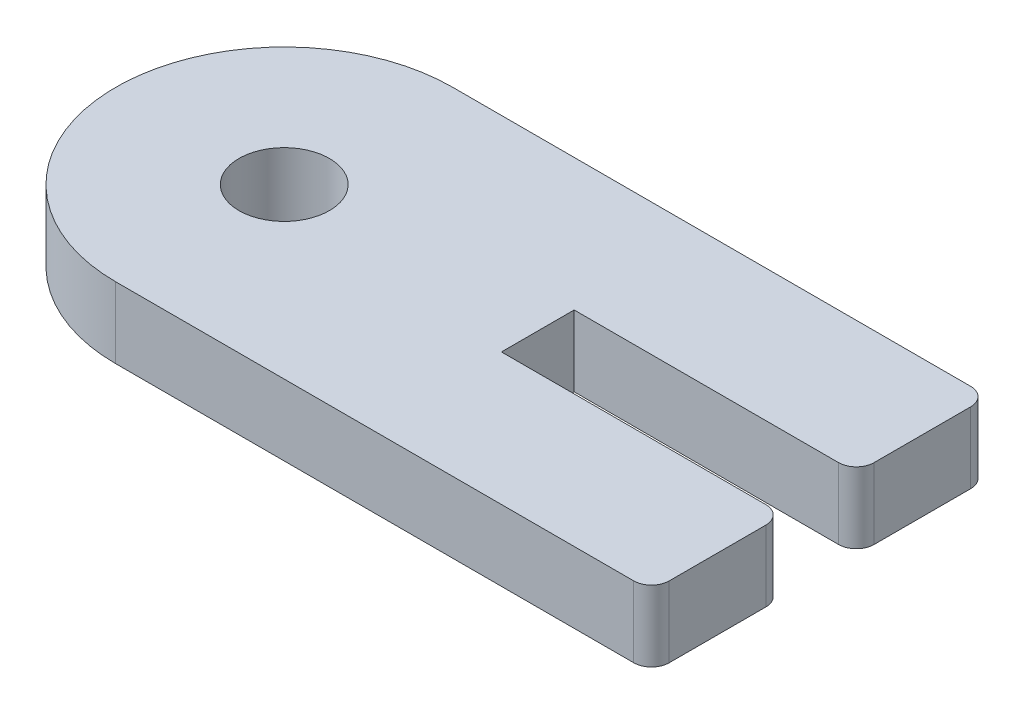
ISO-10303-21;
HEADER;
FILE_DESCRIPTION(('STEP AP214'),'2;1');
FILE_NAME('part.step','',(''),(''),'','','');
FILE_SCHEMA(('AUTOMOTIVE_DESIGN { 1 0 10303 214 1 1 1 1 }'));
ENDSEC;
DATA;
#1=APPLICATION_CONTEXT('core data for automotive mechanical design processes');
#2=APPLICATION_PROTOCOL_DEFINITION('international standard','automotive_design',2000,#1);
#3=PRODUCT_CONTEXT('',#1,'mechanical');
#4=PRODUCT('Part','Part','',(#3));
#5=PRODUCT_RELATED_PRODUCT_CATEGORY('part','',(#4));
#6=PRODUCT_DEFINITION_FORMATION('','',#4);
#7=PRODUCT_DEFINITION_CONTEXT('part definition',#1,'design');
#8=PRODUCT_DEFINITION('design','',#6,#7);
#9=PRODUCT_DEFINITION_SHAPE('','',#8);
#10=(LENGTH_UNIT() NAMED_UNIT(*) SI_UNIT(.MILLI.,.METRE.));
#11=(NAMED_UNIT(*) PLANE_ANGLE_UNIT() SI_UNIT($,.RADIAN.));
#12=(NAMED_UNIT(*) SI_UNIT($,.STERADIAN.) SOLID_ANGLE_UNIT());
#13=UNCERTAINTY_MEASURE_WITH_UNIT(LENGTH_MEASURE(1.E-05),#10,'distance_accuracy_value','');
#14=(GEOMETRIC_REPRESENTATION_CONTEXT(3) GLOBAL_UNCERTAINTY_ASSIGNED_CONTEXT((#13)) GLOBAL_UNIT_ASSIGNED_CONTEXT((#10,
#11,#12)) REPRESENTATION_CONTEXT('',''));
#15=CARTESIAN_POINT('',(0.,0.,0.));
#16=DIRECTION('',(0.,0.,1.));
#17=DIRECTION('',(1.,0.,0.));
#18=AXIS2_PLACEMENT_3D('',#15,#16,#17);
#19=CARTESIAN_POINT('',(27.06,4.,3.05));
#20=DIRECTION('',(0.,-1.,0.));
#21=DIRECTION('',(0.,0.,-1.));
#22=AXIS2_PLACEMENT_3D('',#19,#20,#21);
#23=PLANE('',#22);
#24=DIRECTION('',(0.,0.,-1.));
#25=VECTOR('',#24,1.);
#26=CARTESIAN_POINT('',(12.15,4.,-2.05));
#27=LINE('',#26,#25);
#28=CARTESIAN_POINT('',(12.15,4.,2.05));
#29=VERTEX_POINT('',#28);
#30=CARTESIAN_POINT('',(12.15,4.,-2.05));
#31=VERTEX_POINT('',#30);
#32=EDGE_CURVE('E177',#29,#31,#27,.T.);
#33=ORIENTED_EDGE('',*,*,#32,.T.);
#34=DIRECTION('',(1.,0.,0.));
#35=VECTOR('',#34,1.);
#36=CARTESIAN_POINT('',(27.06,4.,-2.05));
#37=LINE('',#36,#35);
#38=CARTESIAN_POINT('',(27.06,4.,-2.05));
#39=VERTEX_POINT('',#38);
#40=EDGE_CURVE('E105',#31,#39,#37,.T.);
#41=ORIENTED_EDGE('',*,*,#40,.T.);
#42=CARTESIAN_POINT('',(27.06,4.,-3.05));
#43=DIRECTION('',(0.,1.,0.));
#44=DIRECTION('',(0.,0.,1.));
#45=AXIS2_PLACEMENT_3D('',#42,#43,#44);
#46=CIRCLE('',#45,1.);
#47=CARTESIAN_POINT('',(28.06,4.,-3.05000000000001));
#48=VERTEX_POINT('',#47);
#49=EDGE_CURVE('E204',#39,#48,#46,.T.);
#50=ORIENTED_EDGE('',*,*,#49,.T.);
#51=DIRECTION('',(0.,0.,-1.));
#52=VECTOR('',#51,1.);
#53=CARTESIAN_POINT('',(28.06,4.,-8.49999999999999));
#54=LINE('',#53,#52);
#55=CARTESIAN_POINT('',(28.06,4.,-8.49999999999999));
#56=VERTEX_POINT('',#55);
#57=EDGE_CURVE('E223',#48,#56,#54,.T.);
#58=ORIENTED_EDGE('',*,*,#57,.T.);
#59=CARTESIAN_POINT('',(27.06,4.,-8.5));
#60=DIRECTION('',(0.,1.,0.));
#61=DIRECTION('',(0.,0.,-1.));
#62=AXIS2_PLACEMENT_3D('',#59,#60,#61);
#63=CIRCLE('',#62,1.);
#64=CARTESIAN_POINT('',(27.06,4.,-9.5));
#65=VERTEX_POINT('',#64);
#66=EDGE_CURVE('E220',#56,#65,#63,.T.);
#67=ORIENTED_EDGE('',*,*,#66,.T.);
#68=DIRECTION('',(-1.,0.,0.));
#69=VECTOR('',#68,1.);
#70=CARTESIAN_POINT('',(-2.15000000000001,4.,-9.5));
#71=LINE('',#70,#69);
#72=CARTESIAN_POINT('',(-2.15000000000001,4.,-9.5));
#73=VERTEX_POINT('',#72);
#74=EDGE_CURVE('E222',#65,#73,#71,.T.);
#75=ORIENTED_EDGE('',*,*,#74,.T.);
#76=CARTESIAN_POINT('',(-2.15000000000001,4.,0.));
#77=DIRECTION('',(0.,1.,0.));
#78=DIRECTION('',(0.,0.,1.));
#79=AXIS2_PLACEMENT_3D('',#76,#77,#78);
#80=CIRCLE('',#79,9.5);
#81=CARTESIAN_POINT('',(-2.15000000000001,4.,9.5));
#82=VERTEX_POINT('',#81);
#83=EDGE_CURVE('E225',#73,#82,#80,.T.);
#84=ORIENTED_EDGE('',*,*,#83,.T.);
#85=DIRECTION('',(1.,0.,0.));
#86=VECTOR('',#85,1.);
#87=CARTESIAN_POINT('',(27.06,4.,9.5));
#88=LINE('',#87,#86);
#89=CARTESIAN_POINT('',(27.06,4.,9.5));
#90=VERTEX_POINT('',#89);
#91=EDGE_CURVE('E231',#82,#90,#88,.T.);
#92=ORIENTED_EDGE('',*,*,#91,.T.);
#93=CARTESIAN_POINT('',(27.06,4.,8.5));
#94=DIRECTION('',(0.,1.,0.));
#95=DIRECTION('',(0.,0.,-1.));
#96=AXIS2_PLACEMENT_3D('',#93,#94,#95);
#97=CIRCLE('',#96,1.);
#98=CARTESIAN_POINT('',(28.06,4.,8.49999999999999));
#99=VERTEX_POINT('',#98);
#100=EDGE_CURVE('E136',#90,#99,#97,.T.);
#101=ORIENTED_EDGE('',*,*,#100,.T.);
#102=DIRECTION('',(0.,0.,-1.));
#103=VECTOR('',#102,1.);
#104=CARTESIAN_POINT('',(28.06,4.,3.05000000000001));
#105=LINE('',#104,#103);
#106=CARTESIAN_POINT('',(28.06,4.,3.05000000000001));
#107=VERTEX_POINT('',#106);
#108=EDGE_CURVE('E130',#99,#107,#105,.T.);
#109=ORIENTED_EDGE('',*,*,#108,.T.);
#110=CARTESIAN_POINT('',(27.06,4.,3.05));
#111=DIRECTION('',(0.,1.,0.));
#112=DIRECTION('',(0.,0.,-1.));
#113=AXIS2_PLACEMENT_3D('',#110,#111,#112);
#114=CIRCLE('',#113,1.);
#115=CARTESIAN_POINT('',(27.06,4.,2.05));
#116=VERTEX_POINT('',#115);
#117=EDGE_CURVE('E134',#107,#116,#114,.T.);
#118=ORIENTED_EDGE('',*,*,#117,.T.);
#119=DIRECTION('',(-1.,0.,0.));
#120=VECTOR('',#119,1.);
#121=CARTESIAN_POINT('',(27.06,4.,2.05));
#122=LINE('',#121,#120);
#123=EDGE_CURVE('E50',#116,#29,#122,.T.);
#124=ORIENTED_EDGE('',*,*,#123,.T.);
#125=EDGE_LOOP('',(#33,#41,#50,#58,#67,#75,#84,#92,#101,#109,#118,#124));
#126=FACE_BOUND('',#125,.T.);
#127=CARTESIAN_POINT('',(-2.15000000000001,4.,0.));
#128=DIRECTION('',(0.,1.,0.));
#129=DIRECTION('',(0.,0.,1.));
#130=AXIS2_PLACEMENT_3D('',#127,#128,#129);
#131=CIRCLE('',#130,2.55);
#132=CARTESIAN_POINT('',(-2.15000000000001,4.,2.55));
#133=VERTEX_POINT('',#132);
#134=EDGE_CURVE('E158',#133,#133,#131,.T.);
#135=ORIENTED_EDGE('',*,*,#134,.F.);
#136=EDGE_LOOP('',(#135));
#137=FACE_BOUND('',#136,.T.);
#138=ADVANCED_FACE('F33',(#126,#137),#23,.F.);
#139=CARTESIAN_POINT('',(27.06,0.,3.05));
#140=DIRECTION('',(0.,-1.,0.));
#141=DIRECTION('',(0.,0.,-1.));
#142=AXIS2_PLACEMENT_3D('',#139,#140,#141);
#143=PLANE('',#142);
#144=DIRECTION('',(0.,0.,-1.));
#145=VECTOR('',#144,1.);
#146=CARTESIAN_POINT('',(12.15,0.,-2.05));
#147=LINE('',#146,#145);
#148=CARTESIAN_POINT('',(12.15,0.,2.05));
#149=VERTEX_POINT('',#148);
#150=CARTESIAN_POINT('',(12.15,0.,-2.05));
#151=VERTEX_POINT('',#150);
#152=EDGE_CURVE('E154',#149,#151,#147,.T.);
#153=ORIENTED_EDGE('',*,*,#152,.F.);
#154=DIRECTION('',(-1.,0.,0.));
#155=VECTOR('',#154,1.);
#156=CARTESIAN_POINT('',(27.06,0.,2.05));
#157=LINE('',#156,#155);
#158=CARTESIAN_POINT('',(27.06,0.,2.05));
#159=VERTEX_POINT('',#158);
#160=EDGE_CURVE('E97',#159,#149,#157,.T.);
#161=ORIENTED_EDGE('',*,*,#160,.F.);
#162=CARTESIAN_POINT('',(27.06,0.,3.05));
#163=DIRECTION('',(0.,1.,0.));
#164=DIRECTION('',(0.,0.,-1.));
#165=AXIS2_PLACEMENT_3D('',#162,#163,#164);
#166=CIRCLE('',#165,1.);
#167=CARTESIAN_POINT('',(28.06,0.,3.05000000000001));
#168=VERTEX_POINT('',#167);
#169=EDGE_CURVE('E91',#168,#159,#166,.T.);
#170=ORIENTED_EDGE('',*,*,#169,.F.);
#171=DIRECTION('',(0.,0.,-1.));
#172=VECTOR('',#171,1.);
#173=CARTESIAN_POINT('',(28.06,0.,3.05000000000001));
#174=LINE('',#173,#172);
#175=CARTESIAN_POINT('',(28.06,0.,8.49999999999999));
#176=VERTEX_POINT('',#175);
#177=EDGE_CURVE('E144',#176,#168,#174,.T.);
#178=ORIENTED_EDGE('',*,*,#177,.F.);
#179=CARTESIAN_POINT('',(27.06,0.,8.5));
#180=DIRECTION('',(0.,1.,0.));
#181=DIRECTION('',(0.,0.,-1.));
#182=AXIS2_PLACEMENT_3D('',#179,#180,#181);
#183=CIRCLE('',#182,1.);
#184=CARTESIAN_POINT('',(27.06,0.,9.5));
#185=VERTEX_POINT('',#184);
#186=EDGE_CURVE('E172',#185,#176,#183,.T.);
#187=ORIENTED_EDGE('',*,*,#186,.F.);
#188=DIRECTION('',(1.,0.,0.));
#189=VECTOR('',#188,1.);
#190=CARTESIAN_POINT('',(27.06,0.,9.5));
#191=LINE('',#190,#189);
#192=CARTESIAN_POINT('',(-2.15000000000001,0.,9.5));
#193=VERTEX_POINT('',#192);
#194=EDGE_CURVE('E170',#193,#185,#191,.T.);
#195=ORIENTED_EDGE('',*,*,#194,.F.);
#196=CARTESIAN_POINT('',(-2.15000000000001,0.,0.));
#197=DIRECTION('',(0.,1.,0.));
#198=DIRECTION('',(0.,0.,1.));
#199=AXIS2_PLACEMENT_3D('',#196,#197,#198);
#200=CIRCLE('',#199,9.5);
#201=CARTESIAN_POINT('',(-2.15000000000001,0.,-9.5));
#202=VERTEX_POINT('',#201);
#203=EDGE_CURVE('E168',#202,#193,#200,.T.);
#204=ORIENTED_EDGE('',*,*,#203,.F.);
#205=DIRECTION('',(-1.,0.,0.));
#206=VECTOR('',#205,1.);
#207=CARTESIAN_POINT('',(-2.15000000000001,0.,-9.5));
#208=LINE('',#207,#206);
#209=CARTESIAN_POINT('',(27.06,0.,-9.5));
#210=VERTEX_POINT('',#209);
#211=EDGE_CURVE('E166',#210,#202,#208,.T.);
#212=ORIENTED_EDGE('',*,*,#211,.F.);
#213=CARTESIAN_POINT('',(27.06,0.,-8.5));
#214=DIRECTION('',(0.,1.,0.));
#215=DIRECTION('',(0.,0.,-1.));
#216=AXIS2_PLACEMENT_3D('',#213,#214,#215);
#217=CIRCLE('',#216,1.);
#218=CARTESIAN_POINT('',(28.06,0.,-8.49999999999999));
#219=VERTEX_POINT('',#218);
#220=EDGE_CURVE('E164',#219,#210,#217,.T.);
#221=ORIENTED_EDGE('',*,*,#220,.F.);
#222=DIRECTION('',(0.,0.,-1.));
#223=VECTOR('',#222,1.);
#224=CARTESIAN_POINT('',(28.06,0.,-8.49999999999999));
#225=LINE('',#224,#223);
#226=CARTESIAN_POINT('',(28.06,0.,-3.05000000000001));
#227=VERTEX_POINT('',#226);
#228=EDGE_CURVE('E162',#227,#219,#225,.T.);
#229=ORIENTED_EDGE('',*,*,#228,.F.);
#230=CARTESIAN_POINT('',(27.06,0.,-3.05));
#231=DIRECTION('',(0.,1.,0.));
#232=DIRECTION('',(0.,0.,1.));
#233=AXIS2_PLACEMENT_3D('',#230,#231,#232);
#234=CIRCLE('',#233,1.);
#235=CARTESIAN_POINT('',(27.06,0.,-2.05));
#236=VERTEX_POINT('',#235);
#237=EDGE_CURVE('E160',#236,#227,#234,.T.);
#238=ORIENTED_EDGE('',*,*,#237,.F.);
#239=DIRECTION('',(1.,0.,0.));
#240=VECTOR('',#239,1.);
#241=CARTESIAN_POINT('',(27.06,0.,-2.05));
#242=LINE('',#241,#240);
#243=EDGE_CURVE('E157',#151,#236,#242,.T.);
#244=ORIENTED_EDGE('',*,*,#243,.F.);
#245=EDGE_LOOP('',(#153,#161,#170,#178,#187,#195,#204,#212,#221,#229,#238,#244));
#246=FACE_BOUND('',#245,.T.);
#247=CARTESIAN_POINT('',(-2.15000000000001,0.,0.));
#248=DIRECTION('',(0.,1.,0.));
#249=DIRECTION('',(0.,0.,1.));
#250=AXIS2_PLACEMENT_3D('',#247,#248,#249);
#251=CIRCLE('',#250,2.55);
#252=CARTESIAN_POINT('',(-2.15000000000001,0.,2.55));
#253=VERTEX_POINT('',#252);
#254=EDGE_CURVE('E378',#253,#253,#251,.T.);
#255=ORIENTED_EDGE('',*,*,#254,.T.);
#256=EDGE_LOOP('',(#255));
#257=FACE_BOUND('',#256,.T.);
#258=ADVANCED_FACE('F208',(#246,#257),#143,.T.);
#259=CARTESIAN_POINT('',(12.15,4.,-2.05));
#260=DIRECTION('',(-1.,0.,0.));
#261=DIRECTION('',(0.,0.,1.));
#262=AXIS2_PLACEMENT_3D('',#259,#260,#261);
#263=PLANE('',#262);
#264=ORIENTED_EDGE('',*,*,#152,.T.);
#265=DIRECTION('',(0.,-1.,0.));
#266=VECTOR('',#265,1.);
#267=CARTESIAN_POINT('',(12.15,4.,-2.05));
#268=LINE('',#267,#266);
#269=EDGE_CURVE('E11',#31,#151,#268,.T.);
#270=ORIENTED_EDGE('',*,*,#269,.F.);
#271=ORIENTED_EDGE('',*,*,#32,.F.);
#272=DIRECTION('',(0.,-1.,0.));
#273=VECTOR('',#272,1.);
#274=CARTESIAN_POINT('',(12.15,4.,2.05));
#275=LINE('',#274,#273);
#276=EDGE_CURVE('E150',#29,#149,#275,.T.);
#277=ORIENTED_EDGE('',*,*,#276,.T.);
#278=EDGE_LOOP('',(#264,#270,#271,#277));
#279=FACE_BOUND('',#278,.T.);
#280=ADVANCED_FACE('F35',(#279),#263,.F.);
#281=CARTESIAN_POINT('',(27.06,4.,-2.05));
#282=DIRECTION('',(0.,0.,-1.));
#283=DIRECTION('',(-1.,0.,0.));
#284=AXIS2_PLACEMENT_3D('',#281,#282,#283);
#285=PLANE('',#284);
#286=ORIENTED_EDGE('',*,*,#243,.T.);
#287=DIRECTION('',(0.,-1.,0.));
#288=VECTOR('',#287,1.);
#289=CARTESIAN_POINT('',(27.06,4.,-2.05));
#290=LINE('',#289,#288);
#291=EDGE_CURVE('E42',#39,#236,#290,.T.);
#292=ORIENTED_EDGE('',*,*,#291,.F.);
#293=ORIENTED_EDGE('',*,*,#40,.F.);
#294=ORIENTED_EDGE('',*,*,#269,.T.);
#295=EDGE_LOOP('',(#286,#292,#293,#294));
#296=FACE_BOUND('',#295,.T.);
#297=ADVANCED_FACE('F265',(#296),#285,.F.);
#298=CARTESIAN_POINT('',(27.06,4.,-3.05));
#299=DIRECTION('',(0.,-1.,0.));
#300=DIRECTION('',(0.,0.,-1.));
#301=AXIS2_PLACEMENT_3D('',#298,#299,#300);
#302=CYLINDRICAL_SURFACE('',#301,1.);
#303=ORIENTED_EDGE('',*,*,#237,.T.);
#304=DIRECTION('',(0.,-1.,0.));
#305=VECTOR('',#304,1.);
#306=CARTESIAN_POINT('',(28.06,4.,-3.05000000000001));
#307=LINE('',#306,#305);
#308=EDGE_CURVE('E196',#48,#227,#307,.T.);
#309=ORIENTED_EDGE('',*,*,#308,.F.);
#310=ORIENTED_EDGE('',*,*,#49,.F.);
#311=ORIENTED_EDGE('',*,*,#291,.T.);
#312=EDGE_LOOP('',(#303,#309,#310,#311));
#313=FACE_BOUND('',#312,.T.);
#314=ADVANCED_FACE('F202',(#313),#302,.T.);
#315=CARTESIAN_POINT('',(28.06,4.,-8.49999999999999));
#316=DIRECTION('',(-1.,0.,0.));
#317=DIRECTION('',(0.,0.,1.));
#318=AXIS2_PLACEMENT_3D('',#315,#316,#317);
#319=PLANE('',#318);
#320=ORIENTED_EDGE('',*,*,#228,.T.);
#321=DIRECTION('',(0.,-1.,0.));
#322=VECTOR('',#321,1.);
#323=CARTESIAN_POINT('',(28.06,4.,-8.49999999999999));
#324=LINE('',#323,#322);
#325=EDGE_CURVE('E193',#56,#219,#324,.T.);
#326=ORIENTED_EDGE('',*,*,#325,.F.);
#327=ORIENTED_EDGE('',*,*,#57,.F.);
#328=ORIENTED_EDGE('',*,*,#308,.T.);
#329=EDGE_LOOP('',(#320,#326,#327,#328));
#330=FACE_BOUND('',#329,.T.);
#331=ADVANCED_FACE('F214',(#330),#319,.F.);
#332=CARTESIAN_POINT('',(27.06,4.,-8.5));
#333=DIRECTION('',(0.,-1.,0.));
#334=DIRECTION('',(0.,0.,-1.));
#335=AXIS2_PLACEMENT_3D('',#332,#333,#334);
#336=CYLINDRICAL_SURFACE('',#335,1.);
#337=ORIENTED_EDGE('',*,*,#220,.T.);
#338=DIRECTION('',(0.,-1.,0.));
#339=VECTOR('',#338,1.);
#340=CARTESIAN_POINT('',(27.06,4.,-9.5));
#341=LINE('',#340,#339);
#342=EDGE_CURVE('E190',#65,#210,#341,.T.);
#343=ORIENTED_EDGE('',*,*,#342,.F.);
#344=ORIENTED_EDGE('',*,*,#66,.F.);
#345=ORIENTED_EDGE('',*,*,#325,.T.);
#346=EDGE_LOOP('',(#337,#343,#344,#345));
#347=FACE_BOUND('',#346,.T.);
#348=ADVANCED_FACE('F218',(#347),#336,.T.);
#349=CARTESIAN_POINT('',(-2.15000000000001,4.,-9.5));
#350=DIRECTION('',(0.,0.,1.));
#351=DIRECTION('',(1.,0.,0.));
#352=AXIS2_PLACEMENT_3D('',#349,#350,#351);
#353=PLANE('',#352);
#354=ORIENTED_EDGE('',*,*,#211,.T.);
#355=DIRECTION('',(0.,-1.,0.));
#356=VECTOR('',#355,1.);
#357=CARTESIAN_POINT('',(-2.15000000000001,4.,-9.5));
#358=LINE('',#357,#356);
#359=EDGE_CURVE('E187',#73,#202,#358,.T.);
#360=ORIENTED_EDGE('',*,*,#359,.F.);
#361=ORIENTED_EDGE('',*,*,#74,.F.);
#362=ORIENTED_EDGE('',*,*,#342,.T.);
#363=EDGE_LOOP('',(#354,#360,#361,#362));
#364=FACE_BOUND('',#363,.T.);
#365=ADVANCED_FACE('F278',(#364),#353,.F.);
#366=CARTESIAN_POINT('',(-2.15000000000001,4.,0.));
#367=DIRECTION('',(0.,-1.,0.));
#368=DIRECTION('',(0.,0.,-1.));
#369=AXIS2_PLACEMENT_3D('',#366,#367,#368);
#370=CYLINDRICAL_SURFACE('',#369,9.5);
#371=ORIENTED_EDGE('',*,*,#203,.T.);
#372=DIRECTION('',(0.,-1.,0.));
#373=VECTOR('',#372,1.);
#374=CARTESIAN_POINT('',(-2.15000000000001,4.,9.5));
#375=LINE('',#374,#373);
#376=EDGE_CURVE('E184',#82,#193,#375,.T.);
#377=ORIENTED_EDGE('',*,*,#376,.F.);
#378=ORIENTED_EDGE('',*,*,#83,.F.);
#379=ORIENTED_EDGE('',*,*,#359,.T.);
#380=EDGE_LOOP('',(#371,#377,#378,#379));
#381=FACE_BOUND('',#380,.T.);
#382=ADVANCED_FACE('F281',(#381),#370,.T.);
#383=CARTESIAN_POINT('',(27.06,4.,9.5));
#384=DIRECTION('',(0.,0.,-1.));
#385=DIRECTION('',(-1.,0.,0.));
#386=AXIS2_PLACEMENT_3D('',#383,#384,#385);
#387=PLANE('',#386);
#388=ORIENTED_EDGE('',*,*,#194,.T.);
#389=DIRECTION('',(0.,-1.,0.));
#390=VECTOR('',#389,1.);
#391=CARTESIAN_POINT('',(27.06,4.,9.5));
#392=LINE('',#391,#390);
#393=EDGE_CURVE('E181',#90,#185,#392,.T.);
#394=ORIENTED_EDGE('',*,*,#393,.F.);
#395=ORIENTED_EDGE('',*,*,#91,.F.);
#396=ORIENTED_EDGE('',*,*,#376,.T.);
#397=EDGE_LOOP('',(#388,#394,#395,#396));
#398=FACE_BOUND('',#397,.T.);
#399=ADVANCED_FACE('F237',(#398),#387,.F.);
#400=CARTESIAN_POINT('',(27.06,4.,8.5));
#401=DIRECTION('',(0.,-1.,0.));
#402=DIRECTION('',(0.,0.,-1.));
#403=AXIS2_PLACEMENT_3D('',#400,#401,#402);
#404=CYLINDRICAL_SURFACE('',#403,1.);
#405=ORIENTED_EDGE('',*,*,#186,.T.);
#406=DIRECTION('',(0.,-1.,0.));
#407=VECTOR('',#406,1.);
#408=CARTESIAN_POINT('',(28.06,4.,8.49999999999999));
#409=LINE('',#408,#407);
#410=EDGE_CURVE('E145',#99,#176,#409,.T.);
#411=ORIENTED_EDGE('',*,*,#410,.F.);
#412=ORIENTED_EDGE('',*,*,#100,.F.);
#413=ORIENTED_EDGE('',*,*,#393,.T.);
#414=EDGE_LOOP('',(#405,#411,#412,#413));
#415=FACE_BOUND('',#414,.T.);
#416=ADVANCED_FACE('F241',(#415),#404,.T.);
#417=CARTESIAN_POINT('',(28.06,4.,3.05000000000001));
#418=DIRECTION('',(-1.,0.,0.));
#419=DIRECTION('',(0.,0.,1.));
#420=AXIS2_PLACEMENT_3D('',#417,#418,#419);
#421=PLANE('',#420);
#422=ORIENTED_EDGE('',*,*,#177,.T.);
#423=DIRECTION('',(0.,-1.,0.));
#424=VECTOR('',#423,1.);
#425=CARTESIAN_POINT('',(28.06,4.,3.05000000000001));
#426=LINE('',#425,#424);
#427=EDGE_CURVE('E141',#107,#168,#426,.T.);
#428=ORIENTED_EDGE('',*,*,#427,.F.);
#429=ORIENTED_EDGE('',*,*,#108,.F.);
#430=ORIENTED_EDGE('',*,*,#410,.T.);
#431=EDGE_LOOP('',(#422,#428,#429,#430));
#432=FACE_BOUND('',#431,.T.);
#433=ADVANCED_FACE('F142',(#432),#421,.F.);
#434=CARTESIAN_POINT('',(27.06,4.,3.05));
#435=DIRECTION('',(0.,-1.,0.));
#436=DIRECTION('',(0.,0.,-1.));
#437=AXIS2_PLACEMENT_3D('',#434,#435,#436);
#438=CYLINDRICAL_SURFACE('',#437,1.);
#439=ORIENTED_EDGE('',*,*,#169,.T.);
#440=DIRECTION('',(0.,-1.,0.));
#441=VECTOR('',#440,1.);
#442=CARTESIAN_POINT('',(27.06,4.,2.05));
#443=LINE('',#442,#441);
#444=EDGE_CURVE('E146',#116,#159,#443,.T.);
#445=ORIENTED_EDGE('',*,*,#444,.F.);
#446=ORIENTED_EDGE('',*,*,#117,.F.);
#447=ORIENTED_EDGE('',*,*,#427,.T.);
#448=EDGE_LOOP('',(#439,#445,#446,#447));
#449=FACE_BOUND('',#448,.T.);
#450=ADVANCED_FACE('F148',(#449),#438,.T.);
#451=CARTESIAN_POINT('',(27.06,4.,2.05));
#452=DIRECTION('',(0.,0.,1.));
#453=DIRECTION('',(1.,0.,0.));
#454=AXIS2_PLACEMENT_3D('',#451,#452,#453);
#455=PLANE('',#454);
#456=ORIENTED_EDGE('',*,*,#160,.T.);
#457=ORIENTED_EDGE('',*,*,#276,.F.);
#458=ORIENTED_EDGE('',*,*,#123,.F.);
#459=ORIENTED_EDGE('',*,*,#444,.T.);
#460=EDGE_LOOP('',(#456,#457,#458,#459));
#461=FACE_BOUND('',#460,.T.);
#462=ADVANCED_FACE('F245',(#461),#455,.F.);
#463=CARTESIAN_POINT('',(-2.15000000000001,4.,0.));
#464=DIRECTION('',(0.,-1.,0.));
#465=DIRECTION('',(0.,0.,-1.));
#466=AXIS2_PLACEMENT_3D('',#463,#464,#465);
#467=CYLINDRICAL_SURFACE('',#466,2.55);
#468=ORIENTED_EDGE('',*,*,#134,.T.);
#469=EDGE_LOOP('',(#468));
#470=FACE_BOUND('',#469,.T.);
#471=ORIENTED_EDGE('',*,*,#254,.F.);
#472=EDGE_LOOP('',(#471));
#473=FACE_BOUND('',#472,.T.);
#474=ADVANCED_FACE('F247',(#470,#473),#467,.F.);
#475=CLOSED_SHELL('',(#138,#258,#280,#297,#314,#331,#348,#365,#382,#399,#416,#433,#450,#462,#474));
#476=MANIFOLD_SOLID_BREP('B2',#475);
#477=ADVANCED_BREP_SHAPE_REPRESENTATION('',(#18,#476),#14);
#478=SHAPE_DEFINITION_REPRESENTATION(#9,#477);
ENDSEC;
END-ISO-10303-21;
